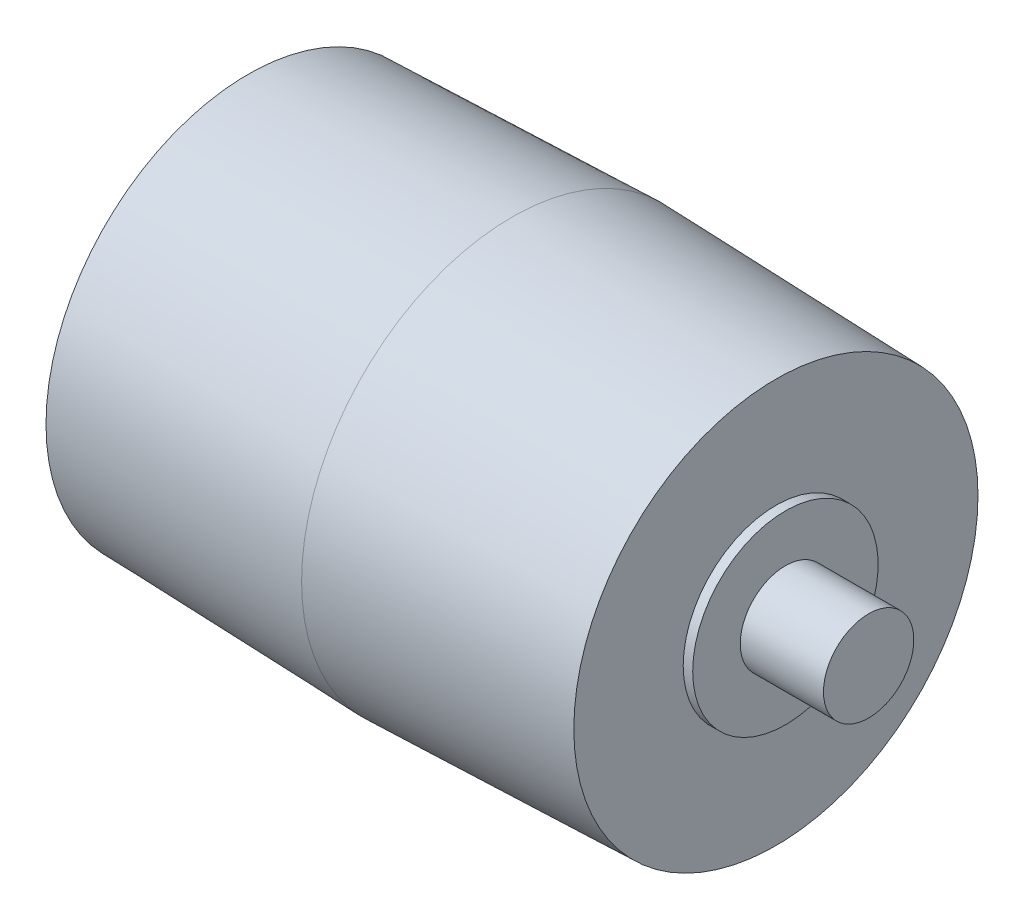
ISO-10303-21;
HEADER;
FILE_DESCRIPTION(('STEP AP214'),'2;1');
FILE_NAME('part.step','',(''),(''),'','','');
FILE_SCHEMA(('AUTOMOTIVE_DESIGN { 1 0 10303 214 1 1 1 1 }'));
ENDSEC;
DATA;
#1=APPLICATION_CONTEXT('core data for automotive mechanical design processes');
#2=APPLICATION_PROTOCOL_DEFINITION('international standard','automotive_design',2000,#1);
#3=PRODUCT_CONTEXT('',#1,'mechanical');
#4=PRODUCT('Part','Part','',(#3));
#5=PRODUCT_RELATED_PRODUCT_CATEGORY('part','',(#4));
#6=PRODUCT_DEFINITION_FORMATION('','',#4);
#7=PRODUCT_DEFINITION_CONTEXT('part definition',#1,'design');
#8=PRODUCT_DEFINITION('design','',#6,#7);
#9=PRODUCT_DEFINITION_SHAPE('','',#8);
#10=(LENGTH_UNIT() NAMED_UNIT(*) SI_UNIT(.MILLI.,.METRE.));
#11=(NAMED_UNIT(*) PLANE_ANGLE_UNIT() SI_UNIT($,.RADIAN.));
#12=(NAMED_UNIT(*) SI_UNIT($,.STERADIAN.) SOLID_ANGLE_UNIT());
#13=UNCERTAINTY_MEASURE_WITH_UNIT(LENGTH_MEASURE(1.E-05),#10,'distance_accuracy_value','');
#14=(GEOMETRIC_REPRESENTATION_CONTEXT(3) GLOBAL_UNCERTAINTY_ASSIGNED_CONTEXT((#13)) GLOBAL_UNIT_ASSIGNED_CONTEXT((#10,
#11,#12)) REPRESENTATION_CONTEXT('',''));
#15=CARTESIAN_POINT('',(0.,0.,0.));
#16=DIRECTION('',(0.,0.,1.));
#17=DIRECTION('',(1.,0.,0.));
#18=AXIS2_PLACEMENT_3D('',#15,#16,#17);
#19=CARTESIAN_POINT('',(9.525,0.,0.));
#20=DIRECTION('',(-1.,0.,0.));
#21=DIRECTION('',(0.,0.,1.));
#22=AXIS2_PLACEMENT_3D('',#19,#20,#21);
#23=PLANE('',#22);
#24=CARTESIAN_POINT('',(9.525,0.,0.));
#25=DIRECTION('',(-1.,0.,0.));
#26=DIRECTION('',(0.,0.,1.));
#27=AXIS2_PLACEMENT_3D('',#24,#25,#26);
#28=CIRCLE('',#27,1.2065);
#29=CARTESIAN_POINT('',(9.525,0.,1.2065));
#30=VERTEX_POINT('',#29);
#31=EDGE_CURVE('E10',#30,#30,#28,.T.);
#32=ORIENTED_EDGE('',*,*,#31,.F.);
#33=EDGE_LOOP('',(#32));
#34=FACE_BOUND('',#33,.T.);
#35=ADVANCED_FACE('F39',(#34),#23,.F.);
#36=CARTESIAN_POINT('',(-9.525,0.,0.));
#37=DIRECTION('',(-1.,0.,0.));
#38=DIRECTION('',(0.,0.,1.));
#39=AXIS2_PLACEMENT_3D('',#36,#37,#38);
#40=CYLINDRICAL_SURFACE('',#39,1.2065);
#41=CARTESIAN_POINT('',(7.3025,0.,0.));
#42=DIRECTION('',(-1.,0.,0.));
#43=DIRECTION('',(0.,0.,1.));
#44=AXIS2_PLACEMENT_3D('',#41,#42,#43);
#45=CIRCLE('',#44,1.2065);
#46=CARTESIAN_POINT('',(7.3025,0.,1.2065));
#47=VERTEX_POINT('',#46);
#48=EDGE_CURVE('E44',#47,#47,#45,.T.);
#49=ORIENTED_EDGE('',*,*,#48,.F.);
#50=EDGE_LOOP('',(#49));
#51=FACE_BOUND('',#50,.T.);
#52=ORIENTED_EDGE('',*,*,#31,.T.);
#53=EDGE_LOOP('',(#52));
#54=FACE_BOUND('',#53,.T.);
#55=ADVANCED_FACE('F131',(#51,#54),#40,.T.);
#56=CARTESIAN_POINT('',(7.3025,1.2065,0.));
#57=DIRECTION('',(-1.,0.,0.));
#58=DIRECTION('',(0.,0.,1.));
#59=AXIS2_PLACEMENT_3D('',#56,#57,#58);
#60=PLANE('',#59);
#61=CARTESIAN_POINT('',(7.3025,0.,0.));
#62=DIRECTION('',(-1.,0.,0.));
#63=DIRECTION('',(0.,0.,1.));
#64=AXIS2_PLACEMENT_3D('',#61,#62,#63);
#65=CIRCLE('',#64,2.4765);
#66=CARTESIAN_POINT('',(7.3025,0.,2.4765));
#67=VERTEX_POINT('',#66);
#68=EDGE_CURVE('E47',#67,#67,#65,.T.);
#69=ORIENTED_EDGE('',*,*,#68,.F.);
#70=EDGE_LOOP('',(#69));
#71=FACE_BOUND('',#70,.T.);
#72=ORIENTED_EDGE('',*,*,#48,.T.);
#73=EDGE_LOOP('',(#72));
#74=FACE_BOUND('',#73,.T.);
#75=ADVANCED_FACE('F130',(#71,#74),#60,.F.);
#76=CARTESIAN_POINT('',(-9.525,0.,0.));
#77=DIRECTION('',(-1.,0.,0.));
#78=DIRECTION('',(0.,0.,1.));
#79=AXIS2_PLACEMENT_3D('',#76,#77,#78);
#80=CYLINDRICAL_SURFACE('',#79,2.4765);
#81=CARTESIAN_POINT('',(7.0485,0.,0.));
#82=DIRECTION('',(-1.,0.,0.));
#83=DIRECTION('',(0.,0.,1.));
#84=AXIS2_PLACEMENT_3D('',#81,#82,#83);
#85=CIRCLE('',#84,2.4765);
#86=CARTESIAN_POINT('',(7.0485,0.,2.4765));
#87=VERTEX_POINT('',#86);
#88=EDGE_CURVE('E52',#87,#87,#85,.T.);
#89=ORIENTED_EDGE('',*,*,#88,.F.);
#90=EDGE_LOOP('',(#89));
#91=FACE_BOUND('',#90,.T.);
#92=ORIENTED_EDGE('',*,*,#68,.T.);
#93=EDGE_LOOP('',(#92));
#94=FACE_BOUND('',#93,.T.);
#95=ADVANCED_FACE('F121',(#91,#94),#80,.T.);
#96=CARTESIAN_POINT('',(7.0485,2.4765,0.));
#97=DIRECTION('',(-1.,0.,0.));
#98=DIRECTION('',(0.,0.,1.));
#99=AXIS2_PLACEMENT_3D('',#96,#97,#98);
#100=PLANE('',#99);
#101=CARTESIAN_POINT('',(7.0485,0.,0.));
#102=DIRECTION('',(-1.,0.,0.));
#103=DIRECTION('',(0.,0.,1.));
#104=AXIS2_PLACEMENT_3D('',#101,#102,#103);
#105=CIRCLE('',#104,5.3975);
#106=CARTESIAN_POINT('',(7.0485,0.,5.3975));
#107=VERTEX_POINT('',#106);
#108=EDGE_CURVE('E59',#107,#107,#105,.T.);
#109=ORIENTED_EDGE('',*,*,#108,.F.);
#110=EDGE_LOOP('',(#109));
#111=FACE_BOUND('',#110,.T.);
#112=ORIENTED_EDGE('',*,*,#88,.T.);
#113=EDGE_LOOP('',(#112));
#114=FACE_BOUND('',#113,.T.);
#115=ADVANCED_FACE('F113',(#111,#114),#100,.F.);
#116=CARTESIAN_POINT('',(7.0485,0.,0.));
#117=DIRECTION('',(-1.,0.,0.));
#118=DIRECTION('',(0.,0.,1.));
#119=AXIS2_PLACEMENT_3D('',#116,#117,#118);
#120=CONICAL_SURFACE('',#119,5.3975,0.031521087817452);
#121=CARTESIAN_POINT('',(0.,0.,0.));
#122=DIRECTION('',(-1.,0.,0.));
#123=DIRECTION('',(0.,0.,1.));
#124=AXIS2_PLACEMENT_3D('',#121,#122,#123);
#125=CIRCLE('',#124,5.61975);
#126=CARTESIAN_POINT('',(0.,0.,5.61975));
#127=VERTEX_POINT('',#126);
#128=EDGE_CURVE('E64',#127,#127,#125,.T.);
#129=ORIENTED_EDGE('',*,*,#128,.F.);
#130=EDGE_LOOP('',(#129));
#131=FACE_BOUND('',#130,.T.);
#132=ORIENTED_EDGE('',*,*,#108,.T.);
#133=EDGE_LOOP('',(#132));
#134=FACE_BOUND('',#133,.T.);
#135=ADVANCED_FACE('F108',(#131,#134),#120,.T.);
#136=CARTESIAN_POINT('',(0.,0.,0.));
#137=DIRECTION('',(1.,0.,0.));
#138=DIRECTION('',(0.,0.,-1.));
#139=AXIS2_PLACEMENT_3D('',#136,#137,#138);
#140=CONICAL_SURFACE('',#139,5.61975,0.0315210878174522);
#141=CARTESIAN_POINT('',(-7.0485,0.,0.));
#142=DIRECTION('',(-1.,0.,0.));
#143=DIRECTION('',(0.,0.,1.));
#144=AXIS2_PLACEMENT_3D('',#141,#142,#143);
#145=CIRCLE('',#144,5.3975);
#146=CARTESIAN_POINT('',(-7.0485,0.,5.3975));
#147=VERTEX_POINT('',#146);
#148=EDGE_CURVE('E63',#147,#147,#145,.T.);
#149=ORIENTED_EDGE('',*,*,#148,.F.);
#150=EDGE_LOOP('',(#149));
#151=FACE_BOUND('',#150,.T.);
#152=ORIENTED_EDGE('',*,*,#128,.T.);
#153=EDGE_LOOP('',(#152));
#154=FACE_BOUND('',#153,.T.);
#155=ADVANCED_FACE('F103',(#151,#154),#140,.T.);
#156=CARTESIAN_POINT('',(-7.0485,2.4765,0.));
#157=DIRECTION('',(1.,0.,0.));
#158=DIRECTION('',(0.,0.,-1.));
#159=AXIS2_PLACEMENT_3D('',#156,#157,#158);
#160=PLANE('',#159);
#161=CARTESIAN_POINT('',(-7.0485,0.,0.));
#162=DIRECTION('',(-1.,0.,0.));
#163=DIRECTION('',(0.,0.,1.));
#164=AXIS2_PLACEMENT_3D('',#161,#162,#163);
#165=CIRCLE('',#164,2.4765);
#166=CARTESIAN_POINT('',(-7.0485,0.,2.4765));
#167=VERTEX_POINT('',#166);
#168=EDGE_CURVE('E67',#167,#167,#165,.T.);
#169=ORIENTED_EDGE('',*,*,#168,.F.);
#170=EDGE_LOOP('',(#169));
#171=FACE_BOUND('',#170,.T.);
#172=ORIENTED_EDGE('',*,*,#148,.T.);
#173=EDGE_LOOP('',(#172));
#174=FACE_BOUND('',#173,.T.);
#175=ADVANCED_FACE('F100',(#171,#174),#160,.F.);
#176=CARTESIAN_POINT('',(-9.525,0.,0.));
#177=DIRECTION('',(-1.,0.,0.));
#178=DIRECTION('',(0.,0.,1.));
#179=AXIS2_PLACEMENT_3D('',#176,#177,#178);
#180=CYLINDRICAL_SURFACE('',#179,2.4765);
#181=CARTESIAN_POINT('',(-7.3025,0.,0.));
#182=DIRECTION('',(-1.,0.,0.));
#183=DIRECTION('',(0.,0.,1.));
#184=AXIS2_PLACEMENT_3D('',#181,#182,#183);
#185=CIRCLE('',#184,2.4765);
#186=CARTESIAN_POINT('',(-7.3025,0.,2.4765));
#187=VERTEX_POINT('',#186);
#188=EDGE_CURVE('E70',#187,#187,#185,.T.);
#189=ORIENTED_EDGE('',*,*,#188,.F.);
#190=EDGE_LOOP('',(#189));
#191=FACE_BOUND('',#190,.T.);
#192=ORIENTED_EDGE('',*,*,#168,.T.);
#193=EDGE_LOOP('',(#192));
#194=FACE_BOUND('',#193,.T.);
#195=ADVANCED_FACE('F93',(#191,#194),#180,.T.);
#196=CARTESIAN_POINT('',(-7.3025,1.2065,0.));
#197=DIRECTION('',(1.,0.,0.));
#198=DIRECTION('',(0.,0.,-1.));
#199=AXIS2_PLACEMENT_3D('',#196,#197,#198);
#200=PLANE('',#199);
#201=CARTESIAN_POINT('',(-7.3025,0.,0.));
#202=DIRECTION('',(-1.,0.,0.));
#203=DIRECTION('',(0.,0.,1.));
#204=AXIS2_PLACEMENT_3D('',#201,#202,#203);
#205=CIRCLE('',#204,1.2065);
#206=CARTESIAN_POINT('',(-7.3025,0.,1.2065));
#207=VERTEX_POINT('',#206);
#208=EDGE_CURVE('E71',#207,#207,#205,.T.);
#209=ORIENTED_EDGE('',*,*,#208,.F.);
#210=EDGE_LOOP('',(#209));
#211=FACE_BOUND('',#210,.T.);
#212=ORIENTED_EDGE('',*,*,#188,.T.);
#213=EDGE_LOOP('',(#212));
#214=FACE_BOUND('',#213,.T.);
#215=ADVANCED_FACE('F85',(#211,#214),#200,.F.);
#216=CARTESIAN_POINT('',(-9.525,0.,0.));
#217=DIRECTION('',(-1.,0.,0.));
#218=DIRECTION('',(0.,0.,1.));
#219=AXIS2_PLACEMENT_3D('',#216,#217,#218);
#220=CYLINDRICAL_SURFACE('',#219,1.2065);
#221=CARTESIAN_POINT('',(-9.525,0.,0.));
#222=DIRECTION('',(-1.,0.,0.));
#223=DIRECTION('',(0.,0.,1.));
#224=AXIS2_PLACEMENT_3D('',#221,#222,#223);
#225=CIRCLE('',#224,1.2065);
#226=CARTESIAN_POINT('',(-9.525,0.,1.2065));
#227=VERTEX_POINT('',#226);
#228=EDGE_CURVE('E79',#227,#227,#225,.T.);
#229=ORIENTED_EDGE('',*,*,#228,.F.);
#230=EDGE_LOOP('',(#229));
#231=FACE_BOUND('',#230,.T.);
#232=ORIENTED_EDGE('',*,*,#208,.T.);
#233=EDGE_LOOP('',(#232));
#234=FACE_BOUND('',#233,.T.);
#235=ADVANCED_FACE('F82',(#231,#234),#220,.T.);
#236=CARTESIAN_POINT('',(-9.525,0.,0.));
#237=DIRECTION('',(1.,0.,0.));
#238=DIRECTION('',(0.,0.,-1.));
#239=AXIS2_PLACEMENT_3D('',#236,#237,#238);
#240=PLANE('',#239);
#241=ORIENTED_EDGE('',*,*,#228,.T.);
#242=EDGE_LOOP('',(#241));
#243=FACE_BOUND('',#242,.T.);
#244=ADVANCED_FACE('F77',(#243),#240,.F.);
#245=CLOSED_SHELL('',(#35,#55,#75,#95,#115,#135,#155,#175,#195,#215,#235,#244));
#246=MANIFOLD_SOLID_BREP('B2',#245);
#247=ADVANCED_BREP_SHAPE_REPRESENTATION('',(#18,#246),#14);
#248=SHAPE_DEFINITION_REPRESENTATION(#9,#247);
ENDSEC;
END-ISO-10303-21;
